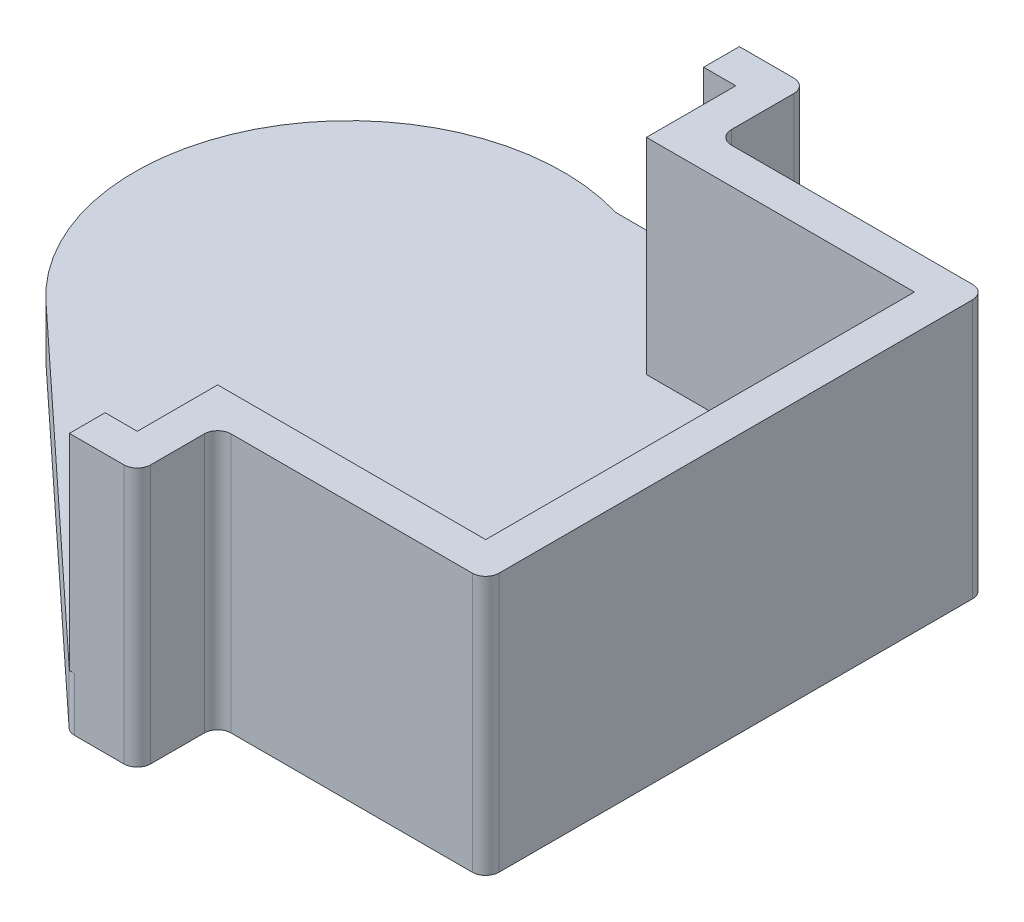
ISO-10303-21;
HEADER;
FILE_DESCRIPTION(('STEP AP214'),'2;1');
FILE_NAME('part.step','',(''),(''),'','','');
FILE_SCHEMA(('AUTOMOTIVE_DESIGN { 1 0 10303 214 1 1 1 1 }'));
ENDSEC;
DATA;
#1=APPLICATION_CONTEXT('core data for automotive mechanical design processes');
#2=APPLICATION_PROTOCOL_DEFINITION('international standard','automotive_design',2000,#1);
#3=PRODUCT_CONTEXT('',#1,'mechanical');
#4=PRODUCT('Part','Part','',(#3));
#5=PRODUCT_RELATED_PRODUCT_CATEGORY('part','',(#4));
#6=PRODUCT_DEFINITION_FORMATION('','',#4);
#7=PRODUCT_DEFINITION_CONTEXT('part definition',#1,'design');
#8=PRODUCT_DEFINITION('design','',#6,#7);
#9=PRODUCT_DEFINITION_SHAPE('','',#8);
#10=(LENGTH_UNIT() NAMED_UNIT(*) SI_UNIT(.MILLI.,.METRE.));
#11=(NAMED_UNIT(*) PLANE_ANGLE_UNIT() SI_UNIT($,.RADIAN.));
#12=(NAMED_UNIT(*) SI_UNIT($,.STERADIAN.) SOLID_ANGLE_UNIT());
#13=UNCERTAINTY_MEASURE_WITH_UNIT(LENGTH_MEASURE(1.E-05),#10,'distance_accuracy_value','');
#14=(GEOMETRIC_REPRESENTATION_CONTEXT(3) GLOBAL_UNCERTAINTY_ASSIGNED_CONTEXT((#13)) GLOBAL_UNIT_ASSIGNED_CONTEXT((#10,
#11,#12)) REPRESENTATION_CONTEXT('',''));
#15=CARTESIAN_POINT('',(0.,0.,0.));
#16=DIRECTION('',(0.,0.,1.));
#17=DIRECTION('',(1.,0.,0.));
#18=AXIS2_PLACEMENT_3D('',#15,#16,#17);
#19=CARTESIAN_POINT('',(6.4,11.5,6.25));
#20=DIRECTION('',(0.,-1.,0.));
#21=DIRECTION('',(0.,0.,-1.));
#22=AXIS2_PLACEMENT_3D('',#19,#20,#21);
#23=CYLINDRICAL_SURFACE('',#22,0.75);
#24=DIRECTION('',(0.,-1.,0.));
#25=VECTOR('',#24,1.);
#26=CARTESIAN_POINT('',(6.39999999999999,11.5,7.));
#27=LINE('',#26,#25);
#28=CARTESIAN_POINT('',(6.39999999999999,11.5,7.));
#29=VERTEX_POINT('',#28);
#30=CARTESIAN_POINT('',(6.39999999999999,-3.,7.));
#31=VERTEX_POINT('',#30);
#32=EDGE_CURVE('E65',#29,#31,#27,.T.);
#33=ORIENTED_EDGE('',*,*,#32,.T.);
#34=CARTESIAN_POINT('',(6.4,-3.,6.25));
#35=DIRECTION('',(0.,1.,0.));
#36=DIRECTION('',(0.,0.,-1.));
#37=AXIS2_PLACEMENT_3D('',#34,#35,#36);
#38=CIRCLE('',#37,0.75);
#39=CARTESIAN_POINT('',(7.15,-3.,6.25));
#40=VERTEX_POINT('',#39);
#41=EDGE_CURVE('E282',#31,#40,#38,.T.);
#42=ORIENTED_EDGE('',*,*,#41,.T.);
#43=DIRECTION('',(0.,-1.,0.));
#44=VECTOR('',#43,1.);
#45=CARTESIAN_POINT('',(7.15,11.5,6.24999999999999));
#46=LINE('',#45,#44);
#47=CARTESIAN_POINT('',(7.15,11.5,6.24999999999999));
#48=VERTEX_POINT('',#47);
#49=EDGE_CURVE('E44',#48,#40,#46,.T.);
#50=ORIENTED_EDGE('',*,*,#49,.F.);
#51=CARTESIAN_POINT('',(6.4,11.5,6.25));
#52=DIRECTION('',(0.,1.,0.));
#53=DIRECTION('',(0.,0.,1.));
#54=AXIS2_PLACEMENT_3D('',#51,#52,#53);
#55=CIRCLE('',#54,0.75);
#56=EDGE_CURVE('E205',#48,#29,#55,.F.);
#57=ORIENTED_EDGE('',*,*,#56,.T.);
#58=EDGE_LOOP('',(#33,#42,#50,#57));
#59=FACE_BOUND('',#58,.T.);
#60=ADVANCED_FACE('F41',(#59),#23,.T.);
#61=CARTESIAN_POINT('',(7.15,11.5,0.));
#62=DIRECTION('',(1.,0.,0.));
#63=DIRECTION('',(0.,0.,-1.));
#64=AXIS2_PLACEMENT_3D('',#61,#62,#63);
#65=PLANE('',#64);
#66=ORIENTED_EDGE('',*,*,#49,.T.);
#67=DIRECTION('',(0.,0.,-1.));
#68=VECTOR('',#67,1.);
#69=CARTESIAN_POINT('',(7.15,-3.,3.25000000000001));
#70=LINE('',#69,#68);
#71=CARTESIAN_POINT('',(7.15,-3.,3.25000000000001));
#72=VERTEX_POINT('',#71);
#73=EDGE_CURVE('E270',#40,#72,#70,.T.);
#74=ORIENTED_EDGE('',*,*,#73,.T.);
#75=DIRECTION('',(0.,-1.,0.));
#76=VECTOR('',#75,1.);
#77=CARTESIAN_POINT('',(7.15,11.5,3.25000000000001));
#78=LINE('',#77,#76);
#79=CARTESIAN_POINT('',(7.15,11.5,3.25000000000001));
#80=VERTEX_POINT('',#79);
#81=EDGE_CURVE('E256',#80,#72,#78,.T.);
#82=ORIENTED_EDGE('',*,*,#81,.F.);
#83=DIRECTION('',(0.,0.,1.));
#84=VECTOR('',#83,1.);
#85=CARTESIAN_POINT('',(7.15,11.5,0.));
#86=LINE('',#85,#84);
#87=EDGE_CURVE('E272',#80,#48,#86,.T.);
#88=ORIENTED_EDGE('',*,*,#87,.T.);
#89=EDGE_LOOP('',(#66,#74,#82,#88));
#90=FACE_BOUND('',#89,.T.);
#91=ADVANCED_FACE('F269',(#90),#65,.T.);
#92=CARTESIAN_POINT('',(7.9,11.5,3.25));
#93=DIRECTION('',(0.,-1.,0.));
#94=DIRECTION('',(0.,0.,-1.));
#95=AXIS2_PLACEMENT_3D('',#92,#93,#94);
#96=CYLINDRICAL_SURFACE('',#95,0.75);
#97=ORIENTED_EDGE('',*,*,#81,.T.);
#98=CARTESIAN_POINT('',(7.9,-3.,3.25));
#99=DIRECTION('',(0.,-1.,0.));
#100=DIRECTION('',(0.,0.,1.));
#101=AXIS2_PLACEMENT_3D('',#98,#99,#100);
#102=CIRCLE('',#101,0.75);
#103=CARTESIAN_POINT('',(7.9,-3.,2.5));
#104=VERTEX_POINT('',#103);
#105=EDGE_CURVE('E284',#72,#104,#102,.T.);
#106=ORIENTED_EDGE('',*,*,#105,.T.);
#107=DIRECTION('',(0.,-1.,0.));
#108=VECTOR('',#107,1.);
#109=CARTESIAN_POINT('',(7.9,11.5,2.5));
#110=LINE('',#109,#108);
#111=CARTESIAN_POINT('',(7.9,11.5,2.5));
#112=VERTEX_POINT('',#111);
#113=EDGE_CURVE('E254',#112,#104,#110,.T.);
#114=ORIENTED_EDGE('',*,*,#113,.F.);
#115=CARTESIAN_POINT('',(7.9,11.5,3.25));
#116=DIRECTION('',(0.,1.,0.));
#117=DIRECTION('',(0.,0.,1.));
#118=AXIS2_PLACEMENT_3D('',#115,#116,#117);
#119=CIRCLE('',#118,0.75);
#120=EDGE_CURVE('E355',#112,#80,#119,.T.);
#121=ORIENTED_EDGE('',*,*,#120,.T.);
#122=EDGE_LOOP('',(#97,#106,#114,#121));
#123=FACE_BOUND('',#122,.T.);
#124=ADVANCED_FACE('F430',(#123),#96,.F.);
#125=CARTESIAN_POINT('',(0.,11.5,2.5));
#126=DIRECTION('',(0.,0.,-1.));
#127=DIRECTION('',(-1.,0.,0.));
#128=AXIS2_PLACEMENT_3D('',#125,#126,#127);
#129=PLANE('',#128);
#130=ORIENTED_EDGE('',*,*,#113,.T.);
#131=DIRECTION('',(1.,0.,0.));
#132=VECTOR('',#131,1.);
#133=CARTESIAN_POINT('',(21.4,-3.,2.5));
#134=LINE('',#133,#132);
#135=CARTESIAN_POINT('',(21.4,-3.,2.5));
#136=VERTEX_POINT('',#135);
#137=EDGE_CURVE('E293',#104,#136,#134,.T.);
#138=ORIENTED_EDGE('',*,*,#137,.T.);
#139=DIRECTION('',(0.,-1.,0.));
#140=VECTOR('',#139,1.);
#141=CARTESIAN_POINT('',(21.4,11.5,2.5));
#142=LINE('',#141,#140);
#143=CARTESIAN_POINT('',(21.4,11.5,2.5));
#144=VERTEX_POINT('',#143);
#145=EDGE_CURVE('E251',#144,#136,#142,.T.);
#146=ORIENTED_EDGE('',*,*,#145,.F.);
#147=DIRECTION('',(1.,0.,0.));
#148=VECTOR('',#147,1.);
#149=CARTESIAN_POINT('',(0.,11.5,2.5));
#150=LINE('',#149,#148);
#151=EDGE_CURVE('E357',#112,#144,#150,.T.);
#152=ORIENTED_EDGE('',*,*,#151,.F.);
#153=EDGE_LOOP('',(#130,#138,#146,#152));
#154=FACE_BOUND('',#153,.T.);
#155=ADVANCED_FACE('F434',(#154),#129,.F.);
#156=CARTESIAN_POINT('',(21.4,11.5,1.75));
#157=DIRECTION('',(0.,-1.,0.));
#158=DIRECTION('',(0.,0.,-1.));
#159=AXIS2_PLACEMENT_3D('',#156,#157,#158);
#160=CYLINDRICAL_SURFACE('',#159,0.75);
#161=ORIENTED_EDGE('',*,*,#145,.T.);
#162=CARTESIAN_POINT('',(21.4,-3.,1.75));
#163=DIRECTION('',(0.,1.,0.));
#164=DIRECTION('',(0.,0.,-1.));
#165=AXIS2_PLACEMENT_3D('',#162,#163,#164);
#166=CIRCLE('',#165,0.75);
#167=CARTESIAN_POINT('',(22.15,-3.,1.74999999999999));
#168=VERTEX_POINT('',#167);
#169=EDGE_CURVE('E296',#136,#168,#166,.T.);
#170=ORIENTED_EDGE('',*,*,#169,.T.);
#171=DIRECTION('',(0.,-1.,0.));
#172=VECTOR('',#171,1.);
#173=CARTESIAN_POINT('',(22.15,11.5,1.74999999999999));
#174=LINE('',#173,#172);
#175=CARTESIAN_POINT('',(22.15,11.5,1.74999999999999));
#176=VERTEX_POINT('',#175);
#177=EDGE_CURVE('E248',#176,#168,#174,.T.);
#178=ORIENTED_EDGE('',*,*,#177,.F.);
#179=CARTESIAN_POINT('',(21.4,11.5,1.75));
#180=DIRECTION('',(0.,1.,0.));
#181=DIRECTION('',(0.,0.,1.));
#182=AXIS2_PLACEMENT_3D('',#179,#180,#181);
#183=CIRCLE('',#182,0.75);
#184=EDGE_CURVE('E359',#176,#144,#183,.F.);
#185=ORIENTED_EDGE('',*,*,#184,.T.);
#186=EDGE_LOOP('',(#161,#170,#178,#185));
#187=FACE_BOUND('',#186,.T.);
#188=ADVANCED_FACE('F439',(#187),#160,.T.);
#189=CARTESIAN_POINT('',(22.15,11.5,0.));
#190=DIRECTION('',(-1.,0.,0.));
#191=DIRECTION('',(0.,0.,1.));
#192=AXIS2_PLACEMENT_3D('',#189,#190,#191);
#193=PLANE('',#192);
#194=ORIENTED_EDGE('',*,*,#177,.T.);
#195=DIRECTION('',(0.,0.,-1.));
#196=VECTOR('',#195,1.);
#197=CARTESIAN_POINT('',(22.15,-3.,-24.75));
#198=LINE('',#197,#196);
#199=CARTESIAN_POINT('',(22.15,-3.,-24.75));
#200=VERTEX_POINT('',#199);
#201=EDGE_CURVE('E299',#168,#200,#198,.T.);
#202=ORIENTED_EDGE('',*,*,#201,.T.);
#203=DIRECTION('',(0.,-1.,0.));
#204=VECTOR('',#203,1.);
#205=CARTESIAN_POINT('',(22.15,11.5,-24.75));
#206=LINE('',#205,#204);
#207=CARTESIAN_POINT('',(22.15,11.5,-24.75));
#208=VERTEX_POINT('',#207);
#209=EDGE_CURVE('E245',#208,#200,#206,.T.);
#210=ORIENTED_EDGE('',*,*,#209,.F.);
#211=DIRECTION('',(0.,0.,-1.));
#212=VECTOR('',#211,1.);
#213=CARTESIAN_POINT('',(22.15,11.5,0.));
#214=LINE('',#213,#212);
#215=EDGE_CURVE('E362',#176,#208,#214,.T.);
#216=ORIENTED_EDGE('',*,*,#215,.F.);
#217=EDGE_LOOP('',(#194,#202,#210,#216));
#218=FACE_BOUND('',#217,.T.);
#219=ADVANCED_FACE('F443',(#218),#193,.F.);
#220=CARTESIAN_POINT('',(21.4,11.5,-24.75));
#221=DIRECTION('',(0.,-1.,0.));
#222=DIRECTION('',(0.,0.,-1.));
#223=AXIS2_PLACEMENT_3D('',#220,#221,#222);
#224=CYLINDRICAL_SURFACE('',#223,0.750000000000001);
#225=ORIENTED_EDGE('',*,*,#209,.T.);
#226=CARTESIAN_POINT('',(21.4,-3.,-24.75));
#227=DIRECTION('',(0.,1.,0.));
#228=DIRECTION('',(0.,0.,-1.));
#229=AXIS2_PLACEMENT_3D('',#226,#227,#228);
#230=CIRCLE('',#229,0.750000000000001);
#231=CARTESIAN_POINT('',(21.4,-3.,-25.5));
#232=VERTEX_POINT('',#231);
#233=EDGE_CURVE('E302',#200,#232,#230,.T.);
#234=ORIENTED_EDGE('',*,*,#233,.T.);
#235=DIRECTION('',(0.,-1.,0.));
#236=VECTOR('',#235,1.);
#237=CARTESIAN_POINT('',(21.4,11.5,-25.5));
#238=LINE('',#237,#236);
#239=CARTESIAN_POINT('',(21.4,11.5,-25.5));
#240=VERTEX_POINT('',#239);
#241=EDGE_CURVE('E242',#240,#232,#238,.T.);
#242=ORIENTED_EDGE('',*,*,#241,.F.);
#243=CARTESIAN_POINT('',(21.4,11.5,-24.75));
#244=DIRECTION('',(0.,1.,0.));
#245=DIRECTION('',(0.,0.,1.));
#246=AXIS2_PLACEMENT_3D('',#243,#244,#245);
#247=CIRCLE('',#246,0.750000000000001);
#248=EDGE_CURVE('E364',#240,#208,#247,.F.);
#249=ORIENTED_EDGE('',*,*,#248,.T.);
#250=EDGE_LOOP('',(#225,#234,#242,#249));
#251=FACE_BOUND('',#250,.T.);
#252=ADVANCED_FACE('F447',(#251),#224,.T.);
#253=CARTESIAN_POINT('',(0.,11.5,-25.5));
#254=DIRECTION('',(0.,0.,-1.));
#255=DIRECTION('',(-1.,0.,0.));
#256=AXIS2_PLACEMENT_3D('',#253,#254,#255);
#257=PLANE('',#256);
#258=ORIENTED_EDGE('',*,*,#241,.T.);
#259=DIRECTION('',(-1.,0.,0.));
#260=VECTOR('',#259,1.);
#261=CARTESIAN_POINT('',(7.9,-3.,-25.5));
#262=LINE('',#261,#260);
#263=CARTESIAN_POINT('',(7.9,-3.,-25.5));
#264=VERTEX_POINT('',#263);
#265=EDGE_CURVE('E305',#232,#264,#262,.T.);
#266=ORIENTED_EDGE('',*,*,#265,.T.);
#267=DIRECTION('',(0.,-1.,0.));
#268=VECTOR('',#267,1.);
#269=CARTESIAN_POINT('',(7.9,11.5,-25.5));
#270=LINE('',#269,#268);
#271=CARTESIAN_POINT('',(7.9,11.5,-25.5));
#272=VERTEX_POINT('',#271);
#273=EDGE_CURVE('E239',#272,#264,#270,.T.);
#274=ORIENTED_EDGE('',*,*,#273,.F.);
#275=DIRECTION('',(1.,0.,0.));
#276=VECTOR('',#275,1.);
#277=CARTESIAN_POINT('',(0.,11.5,-25.5));
#278=LINE('',#277,#276);
#279=EDGE_CURVE('E367',#272,#240,#278,.T.);
#280=ORIENTED_EDGE('',*,*,#279,.T.);
#281=EDGE_LOOP('',(#258,#266,#274,#280));
#282=FACE_BOUND('',#281,.T.);
#283=ADVANCED_FACE('F451',(#282),#257,.T.);
#284=CARTESIAN_POINT('',(7.89999999999999,11.5,-26.25));
#285=DIRECTION('',(0.,-1.,0.));
#286=DIRECTION('',(0.,0.,-1.));
#287=AXIS2_PLACEMENT_3D('',#284,#285,#286);
#288=CYLINDRICAL_SURFACE('',#287,0.750000000000001);
#289=ORIENTED_EDGE('',*,*,#273,.T.);
#290=CARTESIAN_POINT('',(7.9,-3.,-26.25));
#291=DIRECTION('',(0.,-1.,0.));
#292=DIRECTION('',(0.,0.,1.));
#293=AXIS2_PLACEMENT_3D('',#290,#291,#292);
#294=CIRCLE('',#293,0.75);
#295=CARTESIAN_POINT('',(7.15,-3.,-26.25));
#296=VERTEX_POINT('',#295);
#297=EDGE_CURVE('E308',#264,#296,#294,.T.);
#298=ORIENTED_EDGE('',*,*,#297,.T.);
#299=DIRECTION('',(0.,-1.,0.));
#300=VECTOR('',#299,1.);
#301=CARTESIAN_POINT('',(7.14999999999999,11.5,-26.25));
#302=LINE('',#301,#300);
#303=CARTESIAN_POINT('',(7.14999999999999,11.5,-26.25));
#304=VERTEX_POINT('',#303);
#305=EDGE_CURVE('E236',#304,#296,#302,.T.);
#306=ORIENTED_EDGE('',*,*,#305,.F.);
#307=CARTESIAN_POINT('',(7.89999999999999,11.5,-26.25));
#308=DIRECTION('',(0.,1.,0.));
#309=DIRECTION('',(0.,0.,1.));
#310=AXIS2_PLACEMENT_3D('',#307,#308,#309);
#311=CIRCLE('',#310,0.750000000000001);
#312=EDGE_CURVE('E370',#304,#272,#311,.T.);
#313=ORIENTED_EDGE('',*,*,#312,.T.);
#314=EDGE_LOOP('',(#289,#298,#306,#313));
#315=FACE_BOUND('',#314,.T.);
#316=ADVANCED_FACE('F455',(#315),#288,.F.);
#317=CARTESIAN_POINT('',(7.14999999999999,11.5,0.));
#318=DIRECTION('',(1.,0.,0.));
#319=DIRECTION('',(0.,0.,-1.));
#320=AXIS2_PLACEMENT_3D('',#317,#318,#319);
#321=PLANE('',#320);
#322=ORIENTED_EDGE('',*,*,#305,.T.);
#323=DIRECTION('',(0.,0.,-1.));
#324=VECTOR('',#323,1.);
#325=CARTESIAN_POINT('',(7.14999999999999,-3.,-29.75));
#326=LINE('',#325,#324);
#327=CARTESIAN_POINT('',(7.14999999999999,-3.,-29.75));
#328=VERTEX_POINT('',#327);
#329=EDGE_CURVE('E311',#296,#328,#326,.T.);
#330=ORIENTED_EDGE('',*,*,#329,.T.);
#331=DIRECTION('',(0.,-1.,0.));
#332=VECTOR('',#331,1.);
#333=CARTESIAN_POINT('',(7.14999999999999,11.5,-29.75));
#334=LINE('',#333,#332);
#335=CARTESIAN_POINT('',(7.14999999999999,11.5,-29.75));
#336=VERTEX_POINT('',#335);
#337=EDGE_CURVE('E233',#336,#328,#334,.T.);
#338=ORIENTED_EDGE('',*,*,#337,.F.);
#339=DIRECTION('',(0.,0.,1.));
#340=VECTOR('',#339,1.);
#341=CARTESIAN_POINT('',(7.14999999999999,11.5,0.));
#342=LINE('',#341,#340);
#343=EDGE_CURVE('E373',#336,#304,#342,.T.);
#344=ORIENTED_EDGE('',*,*,#343,.T.);
#345=EDGE_LOOP('',(#322,#330,#338,#344));
#346=FACE_BOUND('',#345,.T.);
#347=ADVANCED_FACE('F459',(#346),#321,.T.);
#348=CARTESIAN_POINT('',(6.39999999999999,11.5,-29.75));
#349=DIRECTION('',(0.,-1.,0.));
#350=DIRECTION('',(0.,0.,-1.));
#351=AXIS2_PLACEMENT_3D('',#348,#349,#350);
#352=CYLINDRICAL_SURFACE('',#351,0.750000000000001);
#353=ORIENTED_EDGE('',*,*,#337,.T.);
#354=CARTESIAN_POINT('',(6.39999999999999,-3.,-29.75));
#355=DIRECTION('',(0.,1.,0.));
#356=DIRECTION('',(0.,0.,-1.));
#357=AXIS2_PLACEMENT_3D('',#354,#355,#356);
#358=CIRCLE('',#357,0.75);
#359=CARTESIAN_POINT('',(6.39999999999999,-3.,-30.5));
#360=VERTEX_POINT('',#359);
#361=EDGE_CURVE('E314',#328,#360,#358,.T.);
#362=ORIENTED_EDGE('',*,*,#361,.T.);
#363=DIRECTION('',(0.,-1.,0.));
#364=VECTOR('',#363,1.);
#365=CARTESIAN_POINT('',(6.39999999999998,11.5,-30.5));
#366=LINE('',#365,#364);
#367=CARTESIAN_POINT('',(6.39999999999998,11.5,-30.5));
#368=VERTEX_POINT('',#367);
#369=EDGE_CURVE('E230',#368,#360,#366,.T.);
#370=ORIENTED_EDGE('',*,*,#369,.F.);
#371=CARTESIAN_POINT('',(6.39999999999999,11.5,-29.75));
#372=DIRECTION('',(0.,1.,0.));
#373=DIRECTION('',(0.,0.,1.));
#374=AXIS2_PLACEMENT_3D('',#371,#372,#373);
#375=CIRCLE('',#374,0.750000000000001);
#376=EDGE_CURVE('E376',#336,#368,#375,.T.);
#377=ORIENTED_EDGE('',*,*,#376,.F.);
#378=EDGE_LOOP('',(#353,#362,#370,#377));
#379=FACE_BOUND('',#378,.T.);
#380=ADVANCED_FACE('F463',(#379),#352,.T.);
#381=CARTESIAN_POINT('',(0.,11.5,-30.5));
#382=DIRECTION('',(0.,0.,1.));
#383=DIRECTION('',(1.,0.,0.));
#384=AXIS2_PLACEMENT_3D('',#381,#382,#383);
#385=PLANE('',#384);
#386=ORIENTED_EDGE('',*,*,#369,.T.);
#387=DIRECTION('',(-1.,0.,0.));
#388=VECTOR('',#387,1.);
#389=CARTESIAN_POINT('',(-3.46672887899274,-3.,-30.5));
#390=LINE('',#389,#388);
#391=CARTESIAN_POINT('',(-3.46672887899274,-3.,-30.5));
#392=VERTEX_POINT('',#391);
#393=EDGE_CURVE('E317',#360,#392,#390,.T.);
#394=ORIENTED_EDGE('',*,*,#393,.T.);
#395=DIRECTION('',(0.,1.,0.));
#396=VECTOR('',#395,1.);
#397=CARTESIAN_POINT('',(-3.46672887899274,-3.,-30.5));
#398=LINE('',#397,#396);
#399=CARTESIAN_POINT('',(-3.46672887899274,0.,-30.5));
#400=VERTEX_POINT('',#399);
#401=EDGE_CURVE('E349',#392,#400,#398,.T.);
#402=ORIENTED_EDGE('',*,*,#401,.T.);
#403=DIRECTION('',(-1.,0.,0.));
#404=VECTOR('',#403,1.);
#405=CARTESIAN_POINT('',(-3.46672887899274,0.,-30.5));
#406=LINE('',#405,#404);
#407=CARTESIAN_POINT('',(3.35,0.,-30.5));
#408=VERTEX_POINT('',#407);
#409=EDGE_CURVE('E329',#408,#400,#406,.T.);
#410=ORIENTED_EDGE('',*,*,#409,.F.);
#411=DIRECTION('',(0.,-1.,0.));
#412=VECTOR('',#411,1.);
#413=CARTESIAN_POINT('',(3.35,11.5,-30.5));
#414=LINE('',#413,#412);
#415=CARTESIAN_POINT('',(3.35,11.5,-30.5));
#416=VERTEX_POINT('',#415);
#417=EDGE_CURVE('E227',#416,#408,#414,.T.);
#418=ORIENTED_EDGE('',*,*,#417,.F.);
#419=DIRECTION('',(-1.,0.,0.));
#420=VECTOR('',#419,1.);
#421=CARTESIAN_POINT('',(0.,11.5,-30.5));
#422=LINE('',#421,#420);
#423=EDGE_CURVE('E378',#368,#416,#422,.T.);
#424=ORIENTED_EDGE('',*,*,#423,.F.);
#425=EDGE_LOOP('',(#386,#394,#402,#410,#418,#424));
#426=FACE_BOUND('',#425,.T.);
#427=ADVANCED_FACE('F467',(#426),#385,.F.);
#428=CARTESIAN_POINT('',(3.35,11.5,0.));
#429=DIRECTION('',(1.,0.,0.));
#430=DIRECTION('',(0.,0.,-1.));
#431=AXIS2_PLACEMENT_3D('',#428,#429,#430);
#432=PLANE('',#431);
#433=DIRECTION('',(0.,0.,1.));
#434=VECTOR('',#433,1.);
#435=CARTESIAN_POINT('',(3.35,0.,0.));
#436=LINE('',#435,#434);
#437=CARTESIAN_POINT('',(3.35,0.,-28.5));
#438=VERTEX_POINT('',#437);
#439=EDGE_CURVE('E179',#408,#438,#436,.T.);
#440=ORIENTED_EDGE('',*,*,#439,.T.);
#441=DIRECTION('',(0.,-1.,0.));
#442=VECTOR('',#441,1.);
#443=CARTESIAN_POINT('',(3.35,11.5,-28.5));
#444=LINE('',#443,#442);
#445=CARTESIAN_POINT('',(3.35,11.5,-28.5));
#446=VERTEX_POINT('',#445);
#447=EDGE_CURVE('E224',#446,#438,#444,.T.);
#448=ORIENTED_EDGE('',*,*,#447,.F.);
#449=DIRECTION('',(0.,0.,1.));
#450=VECTOR('',#449,1.);
#451=CARTESIAN_POINT('',(3.35,11.5,0.));
#452=LINE('',#451,#450);
#453=EDGE_CURVE('E380',#416,#446,#452,.T.);
#454=ORIENTED_EDGE('',*,*,#453,.F.);
#455=ORIENTED_EDGE('',*,*,#417,.T.);
#456=EDGE_LOOP('',(#440,#448,#454,#455));
#457=FACE_BOUND('',#456,.T.);
#458=ADVANCED_FACE('F471',(#457),#432,.F.);
#459=CARTESIAN_POINT('',(0.,11.5,-28.5));
#460=DIRECTION('',(0.,0.,-1.));
#461=DIRECTION('',(-1.,0.,0.));
#462=AXIS2_PLACEMENT_3D('',#459,#460,#461);
#463=PLANE('',#462);
#464=DIRECTION('',(1.,0.,0.));
#465=VECTOR('',#464,1.);
#466=CARTESIAN_POINT('',(0.,0.,-28.5));
#467=LINE('',#466,#465);
#468=CARTESIAN_POINT('',(5.14999999999999,0.,-28.5));
#469=VERTEX_POINT('',#468);
#470=EDGE_CURVE('E182',#438,#469,#467,.T.);
#471=ORIENTED_EDGE('',*,*,#470,.T.);
#472=DIRECTION('',(0.,-1.,0.));
#473=VECTOR('',#472,1.);
#474=CARTESIAN_POINT('',(5.14999999999999,11.5,-28.5));
#475=LINE('',#474,#473);
#476=CARTESIAN_POINT('',(5.14999999999999,11.5,-28.5));
#477=VERTEX_POINT('',#476);
#478=EDGE_CURVE('E221',#477,#469,#475,.T.);
#479=ORIENTED_EDGE('',*,*,#478,.F.);
#480=DIRECTION('',(1.,0.,0.));
#481=VECTOR('',#480,1.);
#482=CARTESIAN_POINT('',(0.,11.5,-28.5));
#483=LINE('',#482,#481);
#484=EDGE_CURVE('E382',#446,#477,#483,.T.);
#485=ORIENTED_EDGE('',*,*,#484,.F.);
#486=ORIENTED_EDGE('',*,*,#447,.T.);
#487=EDGE_LOOP('',(#471,#479,#485,#486));
#488=FACE_BOUND('',#487,.T.);
#489=ADVANCED_FACE('F475',(#488),#463,.F.);
#490=CARTESIAN_POINT('',(5.15000000000044,11.5,0.));
#491=DIRECTION('',(-1.,0.,0.));
#492=DIRECTION('',(0.,0.,1.));
#493=AXIS2_PLACEMENT_3D('',#490,#491,#492);
#494=PLANE('',#493);
#495=DIRECTION('',(0.,0.,-1.));
#496=VECTOR('',#495,1.);
#497=CARTESIAN_POINT('',(5.15000000000044,0.,0.));
#498=LINE('',#497,#496);
#499=CARTESIAN_POINT('',(5.14999999999999,0.,-23.5));
#500=VERTEX_POINT('',#499);
#501=EDGE_CURVE('E186',#500,#469,#498,.T.);
#502=ORIENTED_EDGE('',*,*,#501,.F.);
#503=DIRECTION('',(0.,-1.,0.));
#504=VECTOR('',#503,1.);
#505=CARTESIAN_POINT('',(5.14999999999999,11.5,-23.5));
#506=LINE('',#505,#504);
#507=CARTESIAN_POINT('',(5.14999999999999,11.5,-23.5));
#508=VERTEX_POINT('',#507);
#509=EDGE_CURVE('E218',#508,#500,#506,.T.);
#510=ORIENTED_EDGE('',*,*,#509,.F.);
#511=DIRECTION('',(0.,0.,-1.));
#512=VECTOR('',#511,1.);
#513=CARTESIAN_POINT('',(5.15000000000044,11.5,0.));
#514=LINE('',#513,#512);
#515=EDGE_CURVE('E384',#508,#477,#514,.T.);
#516=ORIENTED_EDGE('',*,*,#515,.T.);
#517=ORIENTED_EDGE('',*,*,#478,.T.);
#518=EDGE_LOOP('',(#502,#510,#516,#517));
#519=FACE_BOUND('',#518,.T.);
#520=ADVANCED_FACE('F479',(#519),#494,.T.);
#521=CARTESIAN_POINT('',(0.,11.5,-23.5));
#522=DIRECTION('',(0.,0.,-1.));
#523=DIRECTION('',(-1.,0.,0.));
#524=AXIS2_PLACEMENT_3D('',#521,#522,#523);
#525=PLANE('',#524);
#526=DIRECTION('',(1.,0.,0.));
#527=VECTOR('',#526,1.);
#528=CARTESIAN_POINT('',(0.,0.,-23.5));
#529=LINE('',#528,#527);
#530=CARTESIAN_POINT('',(20.15,0.,-23.5));
#531=VERTEX_POINT('',#530);
#532=EDGE_CURVE('E189',#500,#531,#529,.T.);
#533=ORIENTED_EDGE('',*,*,#532,.T.);
#534=DIRECTION('',(0.,-1.,0.));
#535=VECTOR('',#534,1.);
#536=CARTESIAN_POINT('',(20.15,11.5,-23.5));
#537=LINE('',#536,#535);
#538=CARTESIAN_POINT('',(20.15,11.5,-23.5));
#539=VERTEX_POINT('',#538);
#540=EDGE_CURVE('E215',#539,#531,#537,.T.);
#541=ORIENTED_EDGE('',*,*,#540,.F.);
#542=DIRECTION('',(1.,0.,0.));
#543=VECTOR('',#542,1.);
#544=CARTESIAN_POINT('',(0.,11.5,-23.5));
#545=LINE('',#544,#543);
#546=EDGE_CURVE('E387',#508,#539,#545,.T.);
#547=ORIENTED_EDGE('',*,*,#546,.F.);
#548=ORIENTED_EDGE('',*,*,#509,.T.);
#549=EDGE_LOOP('',(#533,#541,#547,#548));
#550=FACE_BOUND('',#549,.T.);
#551=ADVANCED_FACE('F483',(#550),#525,.F.);
#552=CARTESIAN_POINT('',(20.15,11.5,0.));
#553=DIRECTION('',(-1.,0.,0.));
#554=DIRECTION('',(0.,0.,1.));
#555=AXIS2_PLACEMENT_3D('',#552,#553,#554);
#556=PLANE('',#555);
#557=DIRECTION('',(0.,0.,-1.));
#558=VECTOR('',#557,1.);
#559=CARTESIAN_POINT('',(20.15,0.,0.));
#560=LINE('',#559,#558);
#561=CARTESIAN_POINT('',(20.15,0.,0.5));
#562=VERTEX_POINT('',#561);
#563=EDGE_CURVE('E192',#562,#531,#560,.T.);
#564=ORIENTED_EDGE('',*,*,#563,.F.);
#565=DIRECTION('',(0.,-1.,0.));
#566=VECTOR('',#565,1.);
#567=CARTESIAN_POINT('',(20.15,11.5,0.5));
#568=LINE('',#567,#566);
#569=CARTESIAN_POINT('',(20.15,11.5,0.5));
#570=VERTEX_POINT('',#569);
#571=EDGE_CURVE('E212',#570,#562,#568,.T.);
#572=ORIENTED_EDGE('',*,*,#571,.F.);
#573=DIRECTION('',(0.,0.,-1.));
#574=VECTOR('',#573,1.);
#575=CARTESIAN_POINT('',(20.15,11.5,0.));
#576=LINE('',#575,#574);
#577=EDGE_CURVE('E389',#570,#539,#576,.T.);
#578=ORIENTED_EDGE('',*,*,#577,.T.);
#579=ORIENTED_EDGE('',*,*,#540,.T.);
#580=EDGE_LOOP('',(#564,#572,#578,#579));
#581=FACE_BOUND('',#580,.T.);
#582=ADVANCED_FACE('F404',(#581),#556,.T.);
#583=CARTESIAN_POINT('',(0.,11.5,0.5));
#584=DIRECTION('',(0.,0.,-1.));
#585=DIRECTION('',(-1.,0.,0.));
#586=AXIS2_PLACEMENT_3D('',#583,#584,#585);
#587=PLANE('',#586);
#588=DIRECTION('',(1.,0.,0.));
#589=VECTOR('',#588,1.);
#590=CARTESIAN_POINT('',(0.,0.,0.5));
#591=LINE('',#590,#589);
#592=CARTESIAN_POINT('',(5.15,0.,0.5));
#593=VERTEX_POINT('',#592);
#594=EDGE_CURVE('E195',#593,#562,#591,.T.);
#595=ORIENTED_EDGE('',*,*,#594,.F.);
#596=DIRECTION('',(0.,-1.,0.));
#597=VECTOR('',#596,1.);
#598=CARTESIAN_POINT('',(5.15,11.5,0.5));
#599=LINE('',#598,#597);
#600=CARTESIAN_POINT('',(5.15,11.5,0.5));
#601=VERTEX_POINT('',#600);
#602=EDGE_CURVE('E209',#601,#593,#599,.T.);
#603=ORIENTED_EDGE('',*,*,#602,.F.);
#604=DIRECTION('',(1.,0.,0.));
#605=VECTOR('',#604,1.);
#606=CARTESIAN_POINT('',(0.,11.5,0.5));
#607=LINE('',#606,#605);
#608=EDGE_CURVE('E392',#601,#570,#607,.T.);
#609=ORIENTED_EDGE('',*,*,#608,.T.);
#610=ORIENTED_EDGE('',*,*,#571,.T.);
#611=EDGE_LOOP('',(#595,#603,#609,#610));
#612=FACE_BOUND('',#611,.T.);
#613=ADVANCED_FACE('F396',(#612),#587,.T.);
#614=CARTESIAN_POINT('',(5.15,11.5,0.));
#615=DIRECTION('',(1.,0.,0.));
#616=DIRECTION('',(0.,0.,-1.));
#617=AXIS2_PLACEMENT_3D('',#614,#615,#616);
#618=PLANE('',#617);
#619=DIRECTION('',(0.,0.,1.));
#620=VECTOR('',#619,1.);
#621=CARTESIAN_POINT('',(5.15,0.,0.));
#622=LINE('',#621,#620);
#623=CARTESIAN_POINT('',(5.15,0.,5.));
#624=VERTEX_POINT('',#623);
#625=EDGE_CURVE('E198',#593,#624,#622,.T.);
#626=ORIENTED_EDGE('',*,*,#625,.T.);
#627=DIRECTION('',(0.,-1.,0.));
#628=VECTOR('',#627,1.);
#629=CARTESIAN_POINT('',(5.15,11.5,5.));
#630=LINE('',#629,#628);
#631=CARTESIAN_POINT('',(5.15,11.5,5.));
#632=VERTEX_POINT('',#631);
#633=EDGE_CURVE('E169',#632,#624,#630,.T.);
#634=ORIENTED_EDGE('',*,*,#633,.F.);
#635=DIRECTION('',(0.,0.,1.));
#636=VECTOR('',#635,1.);
#637=CARTESIAN_POINT('',(5.15,11.5,0.));
#638=LINE('',#637,#636);
#639=EDGE_CURVE('E160',#601,#632,#638,.T.);
#640=ORIENTED_EDGE('',*,*,#639,.F.);
#641=ORIENTED_EDGE('',*,*,#602,.T.);
#642=EDGE_LOOP('',(#626,#634,#640,#641));
#643=FACE_BOUND('',#642,.T.);
#644=ADVANCED_FACE('F416',(#643),#618,.F.);
#645=CARTESIAN_POINT('',(0.,11.5,5.));
#646=DIRECTION('',(0.,0.,1.));
#647=DIRECTION('',(1.,0.,0.));
#648=AXIS2_PLACEMENT_3D('',#645,#646,#647);
#649=PLANE('',#648);
#650=DIRECTION('',(-1.,0.,0.));
#651=VECTOR('',#650,1.);
#652=CARTESIAN_POINT('',(0.,0.,5.));
#653=LINE('',#652,#651);
#654=CARTESIAN_POINT('',(3.35,0.,5.));
#655=VERTEX_POINT('',#654);
#656=EDGE_CURVE('E168',#624,#655,#653,.T.);
#657=ORIENTED_EDGE('',*,*,#656,.T.);
#658=DIRECTION('',(0.,-1.,0.));
#659=VECTOR('',#658,1.);
#660=CARTESIAN_POINT('',(3.35,11.5,5.));
#661=LINE('',#660,#659);
#662=CARTESIAN_POINT('',(3.35,11.5,5.));
#663=VERTEX_POINT('',#662);
#664=EDGE_CURVE('E166',#663,#655,#661,.T.);
#665=ORIENTED_EDGE('',*,*,#664,.F.);
#666=DIRECTION('',(-1.,0.,0.));
#667=VECTOR('',#666,1.);
#668=CARTESIAN_POINT('',(0.,11.5,5.));
#669=LINE('',#668,#667);
#670=EDGE_CURVE('E151',#632,#663,#669,.T.);
#671=ORIENTED_EDGE('',*,*,#670,.F.);
#672=ORIENTED_EDGE('',*,*,#633,.T.);
#673=EDGE_LOOP('',(#657,#665,#671,#672));
#674=FACE_BOUND('',#673,.T.);
#675=ADVANCED_FACE('F167',(#674),#649,.F.);
#676=CARTESIAN_POINT('',(3.35,11.5,0.));
#677=DIRECTION('',(1.,0.,0.));
#678=DIRECTION('',(0.,0.,-1.));
#679=AXIS2_PLACEMENT_3D('',#676,#677,#678);
#680=PLANE('',#679);
#681=DIRECTION('',(0.,0.,1.));
#682=VECTOR('',#681,1.);
#683=CARTESIAN_POINT('',(3.35,0.,0.));
#684=LINE('',#683,#682);
#685=CARTESIAN_POINT('',(3.35,0.,6.93968537603666));
#686=VERTEX_POINT('',#685);
#687=EDGE_CURVE('E90',#655,#686,#684,.T.);
#688=ORIENTED_EDGE('',*,*,#687,.T.);
#689=CARTESIAN_POINT('',(3.35,0.,7.));
#690=VERTEX_POINT('',#689);
#691=EDGE_CURVE('E79',#686,#690,#684,.T.);
#692=ORIENTED_EDGE('',*,*,#691,.T.);
#693=DIRECTION('',(0.,-1.,0.));
#694=VECTOR('',#693,1.);
#695=CARTESIAN_POINT('',(3.35,11.5,7.));
#696=LINE('',#695,#694);
#697=CARTESIAN_POINT('',(3.35,11.5,7.));
#698=VERTEX_POINT('',#697);
#699=EDGE_CURVE('E170',#698,#690,#696,.T.);
#700=ORIENTED_EDGE('',*,*,#699,.F.);
#701=DIRECTION('',(0.,0.,1.));
#702=VECTOR('',#701,1.);
#703=CARTESIAN_POINT('',(3.35,11.5,0.));
#704=LINE('',#703,#702);
#705=EDGE_CURVE('E157',#663,#698,#704,.T.);
#706=ORIENTED_EDGE('',*,*,#705,.F.);
#707=ORIENTED_EDGE('',*,*,#664,.T.);
#708=EDGE_LOOP('',(#688,#692,#700,#706,#707));
#709=FACE_BOUND('',#708,.T.);
#710=ADVANCED_FACE('F172',(#709),#680,.F.);
#711=CARTESIAN_POINT('',(0.,11.5,7.));
#712=DIRECTION('',(0.,0.,1.));
#713=DIRECTION('',(1.,0.,0.));
#714=AXIS2_PLACEMENT_3D('',#711,#712,#713);
#715=PLANE('',#714);
#716=DIRECTION('',(-1.,0.,0.));
#717=VECTOR('',#716,1.);
#718=CARTESIAN_POINT('',(0.,0.,7.));
#719=LINE('',#718,#717);
#720=CARTESIAN_POINT('',(3.64467623263707,0.,7.));
#721=VERTEX_POINT('',#720);
#722=EDGE_CURVE('E203',#721,#690,#719,.T.);
#723=ORIENTED_EDGE('',*,*,#722,.F.);
#724=DIRECTION('',(0.,1.,0.));
#725=VECTOR('',#724,1.);
#726=CARTESIAN_POINT('',(3.64467623263707,-3.,7.));
#727=LINE('',#726,#725);
#728=CARTESIAN_POINT('',(3.64467623263707,-3.,7.));
#729=VERTEX_POINT('',#728);
#730=EDGE_CURVE('E57',#729,#721,#727,.T.);
#731=ORIENTED_EDGE('',*,*,#730,.F.);
#732=DIRECTION('',(1.,0.,0.));
#733=VECTOR('',#732,1.);
#734=CARTESIAN_POINT('',(6.39999999999999,-3.,7.));
#735=LINE('',#734,#733);
#736=EDGE_CURVE('E286',#729,#31,#735,.T.);
#737=ORIENTED_EDGE('',*,*,#736,.T.);
#738=ORIENTED_EDGE('',*,*,#32,.F.);
#739=DIRECTION('',(-1.,0.,0.));
#740=VECTOR('',#739,1.);
#741=CARTESIAN_POINT('',(0.,11.5,7.));
#742=LINE('',#741,#740);
#743=EDGE_CURVE('E174',#29,#698,#742,.T.);
#744=ORIENTED_EDGE('',*,*,#743,.T.);
#745=ORIENTED_EDGE('',*,*,#699,.T.);
#746=EDGE_LOOP('',(#723,#731,#737,#738,#744,#745));
#747=FACE_BOUND('',#746,.T.);
#748=ADVANCED_FACE('F530',(#747),#715,.T.);
#749=CARTESIAN_POINT('',(0.,11.5,0.));
#750=DIRECTION('',(0.,1.,0.));
#751=DIRECTION('',(0.,0.,1.));
#752=AXIS2_PLACEMENT_3D('',#749,#750,#751);
#753=PLANE('',#752);
#754=ORIENTED_EDGE('',*,*,#56,.F.);
#755=ORIENTED_EDGE('',*,*,#87,.F.);
#756=ORIENTED_EDGE('',*,*,#120,.F.);
#757=ORIENTED_EDGE('',*,*,#151,.T.);
#758=ORIENTED_EDGE('',*,*,#184,.F.);
#759=ORIENTED_EDGE('',*,*,#215,.T.);
#760=ORIENTED_EDGE('',*,*,#248,.F.);
#761=ORIENTED_EDGE('',*,*,#279,.F.);
#762=ORIENTED_EDGE('',*,*,#312,.F.);
#763=ORIENTED_EDGE('',*,*,#343,.F.);
#764=ORIENTED_EDGE('',*,*,#376,.T.);
#765=ORIENTED_EDGE('',*,*,#423,.T.);
#766=ORIENTED_EDGE('',*,*,#453,.T.);
#767=ORIENTED_EDGE('',*,*,#484,.T.);
#768=ORIENTED_EDGE('',*,*,#515,.F.);
#769=ORIENTED_EDGE('',*,*,#546,.T.);
#770=ORIENTED_EDGE('',*,*,#577,.F.);
#771=ORIENTED_EDGE('',*,*,#608,.F.);
#772=ORIENTED_EDGE('',*,*,#639,.T.);
#773=ORIENTED_EDGE('',*,*,#670,.T.);
#774=ORIENTED_EDGE('',*,*,#705,.T.);
#775=ORIENTED_EDGE('',*,*,#743,.F.);
#776=EDGE_LOOP('',(#754,#755,#756,#757,#758,#759,#760,#761,#762,#763,#764,#765,#766,#767,#768,
#769,#770,#771,#772,#773,#774,#775));
#777=FACE_BOUND('',#776,.T.);
#778=ADVANCED_FACE('F154',(#777),#753,.T.);
#779=CARTESIAN_POINT('',(0.,0.,0.));
#780=DIRECTION('',(0.,1.,0.));
#781=DIRECTION('',(0.,0.,1.));
#782=AXIS2_PLACEMENT_3D('',#779,#780,#781);
#783=PLANE('',#782);
#784=ORIENTED_EDGE('',*,*,#691,.F.);
#785=CARTESIAN_POINT('',(3.64467623263707,0.,6.25));
#786=DIRECTION('',(0.,1.,0.));
#787=DIRECTION('',(0.,0.,1.));
#788=AXIS2_PLACEMENT_3D('',#785,#786,#787);
#789=CIRCLE('',#788,0.75);
#790=EDGE_CURVE('E11',#686,#721,#789,.T.);
#791=ORIENTED_EDGE('',*,*,#790,.T.);
#792=ORIENTED_EDGE('',*,*,#722,.T.);
#793=EDGE_LOOP('',(#784,#791,#792));
#794=FACE_BOUND('',#793,.T.);
#795=ADVANCED_FACE('F553',(#794),#783,.F.);
#796=CARTESIAN_POINT('',(3.64467623263707,0.,6.25));
#797=DIRECTION('',(0.,1.,0.));
#798=DIRECTION('',(0.,0.,1.));
#799=AXIS2_PLACEMENT_3D('',#796,#797,#798);
#800=PLANE('',#799);
#801=ORIENTED_EDGE('',*,*,#687,.F.);
#802=ORIENTED_EDGE('',*,*,#656,.F.);
#803=ORIENTED_EDGE('',*,*,#625,.F.);
#804=ORIENTED_EDGE('',*,*,#594,.T.);
#805=ORIENTED_EDGE('',*,*,#563,.T.);
#806=ORIENTED_EDGE('',*,*,#532,.F.);
#807=ORIENTED_EDGE('',*,*,#501,.T.);
#808=ORIENTED_EDGE('',*,*,#470,.F.);
#809=ORIENTED_EDGE('',*,*,#439,.F.);
#810=ORIENTED_EDGE('',*,*,#409,.T.);
#811=CARTESIAN_POINT('',(-3.46672887899274,0.,-31.25));
#812=DIRECTION('',(0.,-1.,0.));
#813=DIRECTION('',(0.,0.,-1.));
#814=AXIS2_PLACEMENT_3D('',#811,#812,#813);
#815=CIRCLE('',#814,0.750000000000003);
#816=CARTESIAN_POINT('',(-3.67459649950522,0.,-30.5293814793232));
#817=VERTEX_POINT('',#816);
#818=EDGE_CURVE('E332',#400,#817,#815,.T.);
#819=ORIENTED_EDGE('',*,*,#818,.T.);
#820=CARTESIAN_POINT('',(-7.00047842770483,0.,-18.9994851484937));
#821=DIRECTION('',(0.,1.,0.));
#822=DIRECTION('',(0.,0.,1.));
#823=AXIS2_PLACEMENT_3D('',#820,#821,#822);
#824=CIRCLE('',#823,12.);
#825=CARTESIAN_POINT('',(-15.1691120076131,0.,-10.2089547073204));
#826=VERTEX_POINT('',#825);
#827=EDGE_CURVE('E335',#817,#826,#824,.T.);
#828=ORIENTED_EDGE('',*,*,#827,.T.);
#829=DIRECTION('',(0.732544203431107,0.,0.68071946499236));
#830=VECTOR('',#829,1.);
#831=CARTESIAN_POINT('',(3.1341366338928,0.,6.79940815257333));
#832=LINE('',#831,#830);
#833=CARTESIAN_POINT('',(3.1341366338928,0.,6.79940815257333));
#834=VERTEX_POINT('',#833);
#835=EDGE_CURVE('E338',#826,#834,#832,.T.);
#836=ORIENTED_EDGE('',*,*,#835,.T.);
#837=EDGE_CURVE('E50',#834,#686,#789,.T.);
#838=ORIENTED_EDGE('',*,*,#837,.T.);
#839=EDGE_LOOP('',(#801,#802,#803,#804,#805,#806,#807,#808,#809,#810,#819,#828,#836,#838));
#840=FACE_BOUND('',#839,.T.);
#841=ADVANCED_FACE('F408',(#840),#800,.T.);
#842=CARTESIAN_POINT('',(3.64467623263707,-3.,6.25));
#843=DIRECTION('',(0.,1.,0.));
#844=DIRECTION('',(0.,0.,1.));
#845=AXIS2_PLACEMENT_3D('',#842,#843,#844);
#846=CYLINDRICAL_SURFACE('',#845,0.75);
#847=ORIENTED_EDGE('',*,*,#837,.F.);
#848=DIRECTION('',(0.,1.,0.));
#849=VECTOR('',#848,1.);
#850=CARTESIAN_POINT('',(3.1341366338928,-3.,6.79940815257333));
#851=LINE('',#850,#849);
#852=CARTESIAN_POINT('',(3.1341366338928,-3.,6.79940815257333));
#853=VERTEX_POINT('',#852);
#854=EDGE_CURVE('E183',#853,#834,#851,.T.);
#855=ORIENTED_EDGE('',*,*,#854,.F.);
#856=CARTESIAN_POINT('',(3.64467623263707,-3.,6.25));
#857=DIRECTION('',(0.,1.,0.));
#858=DIRECTION('',(0.,0.,1.));
#859=AXIS2_PLACEMENT_3D('',#856,#857,#858);
#860=CIRCLE('',#859,0.75);
#861=EDGE_CURVE('E288',#853,#729,#860,.T.);
#862=ORIENTED_EDGE('',*,*,#861,.T.);
#863=ORIENTED_EDGE('',*,*,#730,.T.);
#864=ORIENTED_EDGE('',*,*,#790,.F.);
#865=EDGE_LOOP('',(#847,#855,#862,#863,#864));
#866=FACE_BOUND('',#865,.T.);
#867=ADVANCED_FACE('F717',(#866),#846,.T.);
#868=CARTESIAN_POINT('',(3.1341366338928,-3.,6.79940815257333));
#869=DIRECTION('',(-0.68071946499236,0.,0.732544203431107));
#870=DIRECTION('',(0.732544203431107,0.,0.68071946499236));
#871=AXIS2_PLACEMENT_3D('',#868,#869,#870);
#872=PLANE('',#871);
#873=ORIENTED_EDGE('',*,*,#835,.F.);
#874=DIRECTION('',(0.,1.,0.));
#875=VECTOR('',#874,1.);
#876=CARTESIAN_POINT('',(-15.1691120076131,-3.,-10.2089547073204));
#877=LINE('',#876,#875);
#878=CARTESIAN_POINT('',(-15.1691120076131,-3.,-10.2089547073204));
#879=VERTEX_POINT('',#878);
#880=EDGE_CURVE('E343',#879,#826,#877,.T.);
#881=ORIENTED_EDGE('',*,*,#880,.F.);
#882=DIRECTION('',(0.732544203431107,0.,0.68071946499236));
#883=VECTOR('',#882,1.);
#884=CARTESIAN_POINT('',(3.1341366338928,-3.,6.79940815257333));
#885=LINE('',#884,#883);
#886=EDGE_CURVE('E326',#879,#853,#885,.T.);
#887=ORIENTED_EDGE('',*,*,#886,.T.);
#888=ORIENTED_EDGE('',*,*,#854,.T.);
#889=EDGE_LOOP('',(#873,#881,#887,#888));
#890=FACE_BOUND('',#889,.T.);
#891=ADVANCED_FACE('F724',(#890),#872,.T.);
#892=CARTESIAN_POINT('',(-7.00047842770483,-3.,-18.9994851484937));
#893=DIRECTION('',(0.,1.,0.));
#894=DIRECTION('',(0.,0.,1.));
#895=AXIS2_PLACEMENT_3D('',#892,#893,#894);
#896=CYLINDRICAL_SURFACE('',#895,12.);
#897=ORIENTED_EDGE('',*,*,#827,.F.);
#898=DIRECTION('',(0.,1.,0.));
#899=VECTOR('',#898,1.);
#900=CARTESIAN_POINT('',(-3.67459649950522,-3.,-30.5293814793232));
#901=LINE('',#900,#899);
#902=CARTESIAN_POINT('',(-3.67459649950522,-3.,-30.5293814793232));
#903=VERTEX_POINT('',#902);
#904=EDGE_CURVE('E346',#903,#817,#901,.T.);
#905=ORIENTED_EDGE('',*,*,#904,.F.);
#906=CARTESIAN_POINT('',(-7.00047842770483,-3.,-18.9994851484937));
#907=DIRECTION('',(0.,1.,0.));
#908=DIRECTION('',(0.,0.,1.));
#909=AXIS2_PLACEMENT_3D('',#906,#907,#908);
#910=CIRCLE('',#909,12.);
#911=EDGE_CURVE('E323',#903,#879,#910,.T.);
#912=ORIENTED_EDGE('',*,*,#911,.T.);
#913=ORIENTED_EDGE('',*,*,#880,.T.);
#914=EDGE_LOOP('',(#897,#905,#912,#913));
#915=FACE_BOUND('',#914,.T.);
#916=ADVANCED_FACE('F732',(#915),#896,.T.);
#917=CARTESIAN_POINT('',(-3.46672887899274,-3.,-31.25));
#918=DIRECTION('',(0.,1.,0.));
#919=DIRECTION('',(0.,0.,1.));
#920=AXIS2_PLACEMENT_3D('',#917,#918,#919);
#921=CYLINDRICAL_SURFACE('',#920,0.750000000000003);
#922=ORIENTED_EDGE('',*,*,#818,.F.);
#923=ORIENTED_EDGE('',*,*,#401,.F.);
#924=CARTESIAN_POINT('',(-3.46672887899274,-3.,-31.25));
#925=DIRECTION('',(0.,-1.,0.));
#926=DIRECTION('',(0.,0.,-1.));
#927=AXIS2_PLACEMENT_3D('',#924,#925,#926);
#928=CIRCLE('',#927,0.750000000000003);
#929=EDGE_CURVE('E320',#392,#903,#928,.T.);
#930=ORIENTED_EDGE('',*,*,#929,.T.);
#931=ORIENTED_EDGE('',*,*,#904,.T.);
#932=EDGE_LOOP('',(#922,#923,#930,#931));
#933=FACE_BOUND('',#932,.T.);
#934=ADVANCED_FACE('F741',(#933),#921,.F.);
#935=CARTESIAN_POINT('',(3.64467623263707,-3.,6.25));
#936=DIRECTION('',(0.,1.,0.));
#937=DIRECTION('',(0.,0.,1.));
#938=AXIS2_PLACEMENT_3D('',#935,#936,#937);
#939=PLANE('',#938);
#940=ORIENTED_EDGE('',*,*,#861,.F.);
#941=ORIENTED_EDGE('',*,*,#886,.F.);
#942=ORIENTED_EDGE('',*,*,#911,.F.);
#943=ORIENTED_EDGE('',*,*,#929,.F.);
#944=ORIENTED_EDGE('',*,*,#393,.F.);
#945=ORIENTED_EDGE('',*,*,#361,.F.);
#946=ORIENTED_EDGE('',*,*,#329,.F.);
#947=ORIENTED_EDGE('',*,*,#297,.F.);
#948=ORIENTED_EDGE('',*,*,#265,.F.);
#949=ORIENTED_EDGE('',*,*,#233,.F.);
#950=ORIENTED_EDGE('',*,*,#201,.F.);
#951=ORIENTED_EDGE('',*,*,#169,.F.);
#952=ORIENTED_EDGE('',*,*,#137,.F.);
#953=ORIENTED_EDGE('',*,*,#105,.F.);
#954=ORIENTED_EDGE('',*,*,#73,.F.);
#955=ORIENTED_EDGE('',*,*,#41,.F.);
#956=ORIENTED_EDGE('',*,*,#736,.F.);
#957=EDGE_LOOP('',(#940,#941,#942,#943,#944,#945,#946,#947,#948,#949,#950,#951,#952,#953,#954,
#955,#956));
#958=FACE_BOUND('',#957,.T.);
#959=ADVANCED_FACE('F280',(#958),#939,.F.);
#960=CLOSED_SHELL('',(#60,#91,#124,#155,#188,#219,#252,#283,#316,#347,#380,#427,#458,#489,#520,
#551,#582,#613,#644,#675,#710,#748,#778,#795,#841,#867,#891,#916,#934,#959));
#961=MANIFOLD_SOLID_BREP('B2',#960);
#962=ADVANCED_BREP_SHAPE_REPRESENTATION('',(#18,#961),#14);
#963=SHAPE_DEFINITION_REPRESENTATION(#9,#962);
ENDSEC;
END-ISO-10303-21;
